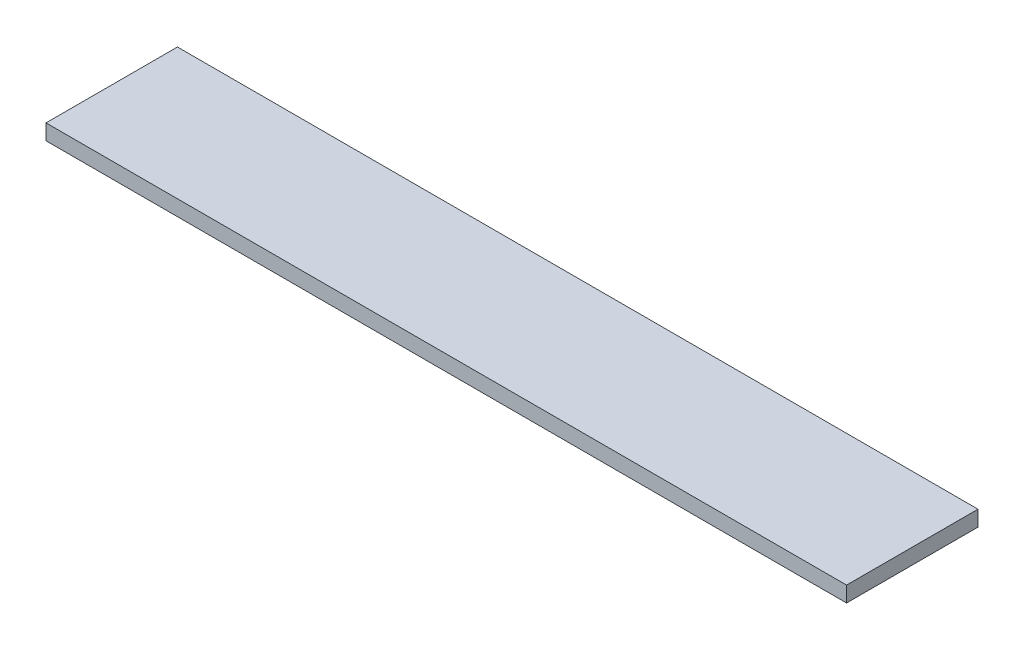
ISO-10303-21;
HEADER;
FILE_DESCRIPTION(('STEP AP214'),'2;1');
FILE_NAME('part.step','',(''),(''),'','','');
FILE_SCHEMA(('AUTOMOTIVE_DESIGN { 1 0 10303 214 1 1 1 1 }'));
ENDSEC;
DATA;
#1=APPLICATION_CONTEXT('core data for automotive mechanical design processes');
#2=APPLICATION_PROTOCOL_DEFINITION('international standard','automotive_design',2000,#1);
#3=PRODUCT_CONTEXT('',#1,'mechanical');
#4=PRODUCT('Part','Part','',(#3));
#5=PRODUCT_RELATED_PRODUCT_CATEGORY('part','',(#4));
#6=PRODUCT_DEFINITION_FORMATION('','',#4);
#7=PRODUCT_DEFINITION_CONTEXT('part definition',#1,'design');
#8=PRODUCT_DEFINITION('design','',#6,#7);
#9=PRODUCT_DEFINITION_SHAPE('','',#8);
#10=(LENGTH_UNIT() NAMED_UNIT(*) SI_UNIT(.MILLI.,.METRE.));
#11=(NAMED_UNIT(*) PLANE_ANGLE_UNIT() SI_UNIT($,.RADIAN.));
#12=(NAMED_UNIT(*) SI_UNIT($,.STERADIAN.) SOLID_ANGLE_UNIT());
#13=UNCERTAINTY_MEASURE_WITH_UNIT(LENGTH_MEASURE(1.E-05),#10,'distance_accuracy_value','');
#14=(GEOMETRIC_REPRESENTATION_CONTEXT(3) GLOBAL_UNCERTAINTY_ASSIGNED_CONTEXT((#13)) GLOBAL_UNIT_ASSIGNED_CONTEXT((#10,
#11,#12)) REPRESENTATION_CONTEXT('',''));
#15=CARTESIAN_POINT('',(0.,0.,0.));
#16=DIRECTION('',(0.,0.,1.));
#17=DIRECTION('',(1.,0.,0.));
#18=AXIS2_PLACEMENT_3D('',#15,#16,#17);
#19=CARTESIAN_POINT('',(-15.625,1.3,-7.5));
#20=DIRECTION('',(1.,0.,0.));
#21=DIRECTION('',(0.,0.,-1.));
#22=AXIS2_PLACEMENT_3D('',#19,#20,#21);
#23=PLANE('',#22);
#24=DIRECTION('',(0.,0.,1.));
#25=VECTOR('',#24,1.);
#26=CARTESIAN_POINT('',(-15.625,0.,-7.5));
#27=LINE('',#26,#25);
#28=CARTESIAN_POINT('',(-15.625,0.,-7.5));
#29=VERTEX_POINT('',#28);
#30=CARTESIAN_POINT('',(-15.625,0.,3.5));
#31=VERTEX_POINT('',#30);
#32=EDGE_CURVE('E113',#29,#31,#27,.T.);
#33=ORIENTED_EDGE('',*,*,#32,.T.);
#34=DIRECTION('',(0.,-1.,0.));
#35=VECTOR('',#34,1.);
#36=CARTESIAN_POINT('',(-15.625,1.3,3.5));
#37=LINE('',#36,#35);
#38=CARTESIAN_POINT('',(-15.625,1.3,3.5));
#39=VERTEX_POINT('',#38);
#40=EDGE_CURVE('E11',#39,#31,#37,.T.);
#41=ORIENTED_EDGE('',*,*,#40,.F.);
#42=DIRECTION('',(0.,0.,1.));
#43=VECTOR('',#42,1.);
#44=CARTESIAN_POINT('',(-15.625,1.3,-7.5));
#45=LINE('',#44,#43);
#46=CARTESIAN_POINT('',(-15.625,1.3,-7.5));
#47=VERTEX_POINT('',#46);
#48=EDGE_CURVE('E97',#47,#39,#45,.T.);
#49=ORIENTED_EDGE('',*,*,#48,.F.);
#50=DIRECTION('',(0.,-1.,0.));
#51=VECTOR('',#50,1.);
#52=CARTESIAN_POINT('',(-15.625,1.3,-7.5));
#53=LINE('',#52,#51);
#54=EDGE_CURVE('E109',#47,#29,#53,.T.);
#55=ORIENTED_EDGE('',*,*,#54,.T.);
#56=EDGE_LOOP('',(#33,#41,#49,#55));
#57=FACE_BOUND('',#56,.T.);
#58=ADVANCED_FACE('F45',(#57),#23,.F.);
#59=CARTESIAN_POINT('',(-15.625,1.3,3.5));
#60=DIRECTION('',(0.,0.,-1.));
#61=DIRECTION('',(-1.,0.,0.));
#62=AXIS2_PLACEMENT_3D('',#59,#60,#61);
#63=PLANE('',#62);
#64=DIRECTION('',(1.,0.,0.));
#65=VECTOR('',#64,1.);
#66=CARTESIAN_POINT('',(-15.625,0.,3.5));
#67=LINE('',#66,#65);
#68=CARTESIAN_POINT('',(51.375,0.,3.5));
#69=VERTEX_POINT('',#68);
#70=EDGE_CURVE('E102',#31,#69,#67,.T.);
#71=ORIENTED_EDGE('',*,*,#70,.T.);
#72=DIRECTION('',(0.,-1.,0.));
#73=VECTOR('',#72,1.);
#74=CARTESIAN_POINT('',(51.375,1.3,3.5));
#75=LINE('',#74,#73);
#76=CARTESIAN_POINT('',(51.375,1.3,3.5));
#77=VERTEX_POINT('',#76);
#78=EDGE_CURVE('E54',#77,#69,#75,.T.);
#79=ORIENTED_EDGE('',*,*,#78,.F.);
#80=DIRECTION('',(1.,0.,0.));
#81=VECTOR('',#80,1.);
#82=CARTESIAN_POINT('',(-15.625,1.3,3.5));
#83=LINE('',#82,#81);
#84=EDGE_CURVE('E92',#39,#77,#83,.T.);
#85=ORIENTED_EDGE('',*,*,#84,.F.);
#86=ORIENTED_EDGE('',*,*,#40,.T.);
#87=EDGE_LOOP('',(#71,#79,#85,#86));
#88=FACE_BOUND('',#87,.T.);
#89=ADVANCED_FACE('F101',(#88),#63,.F.);
#90=CARTESIAN_POINT('',(51.375,1.3,-7.5));
#91=DIRECTION('',(-1.,0.,0.));
#92=DIRECTION('',(0.,0.,1.));
#93=AXIS2_PLACEMENT_3D('',#90,#91,#92);
#94=PLANE('',#93);
#95=DIRECTION('',(0.,0.,-1.));
#96=VECTOR('',#95,1.);
#97=CARTESIAN_POINT('',(51.375,0.,-7.5));
#98=LINE('',#97,#96);
#99=CARTESIAN_POINT('',(51.375,0.,-7.5));
#100=VERTEX_POINT('',#99);
#101=EDGE_CURVE('E79',#69,#100,#98,.T.);
#102=ORIENTED_EDGE('',*,*,#101,.T.);
#103=DIRECTION('',(0.,-1.,0.));
#104=VECTOR('',#103,1.);
#105=CARTESIAN_POINT('',(51.375,1.3,-7.5));
#106=LINE('',#105,#104);
#107=CARTESIAN_POINT('',(51.375,1.3,-7.5));
#108=VERTEX_POINT('',#107);
#109=EDGE_CURVE('E104',#108,#100,#106,.T.);
#110=ORIENTED_EDGE('',*,*,#109,.F.);
#111=DIRECTION('',(0.,0.,-1.));
#112=VECTOR('',#111,1.);
#113=CARTESIAN_POINT('',(51.375,1.3,-7.5));
#114=LINE('',#113,#112);
#115=EDGE_CURVE('E95',#77,#108,#114,.T.);
#116=ORIENTED_EDGE('',*,*,#115,.F.);
#117=ORIENTED_EDGE('',*,*,#78,.T.);
#118=EDGE_LOOP('',(#102,#110,#116,#117));
#119=FACE_BOUND('',#118,.T.);
#120=ADVANCED_FACE('F105',(#119),#94,.F.);
#121=CARTESIAN_POINT('',(-15.625,1.3,-7.5));
#122=DIRECTION('',(0.,0.,1.));
#123=DIRECTION('',(1.,0.,0.));
#124=AXIS2_PLACEMENT_3D('',#121,#122,#123);
#125=PLANE('',#124);
#126=DIRECTION('',(-1.,0.,0.));
#127=VECTOR('',#126,1.);
#128=CARTESIAN_POINT('',(-15.625,0.,-7.5));
#129=LINE('',#128,#127);
#130=EDGE_CURVE('E85',#100,#29,#129,.T.);
#131=ORIENTED_EDGE('',*,*,#130,.T.);
#132=ORIENTED_EDGE('',*,*,#54,.F.);
#133=DIRECTION('',(-1.,0.,0.));
#134=VECTOR('',#133,1.);
#135=CARTESIAN_POINT('',(-15.625,1.3,-7.5));
#136=LINE('',#135,#134);
#137=EDGE_CURVE('E62',#108,#47,#136,.T.);
#138=ORIENTED_EDGE('',*,*,#137,.F.);
#139=ORIENTED_EDGE('',*,*,#109,.T.);
#140=EDGE_LOOP('',(#131,#132,#138,#139));
#141=FACE_BOUND('',#140,.T.);
#142=ADVANCED_FACE('F126',(#141),#125,.F.);
#143=CARTESIAN_POINT('',(0.,1.3,0.));
#144=DIRECTION('',(0.,1.,0.));
#145=DIRECTION('',(0.,0.,1.));
#146=AXIS2_PLACEMENT_3D('',#143,#144,#145);
#147=PLANE('',#146);
#148=ORIENTED_EDGE('',*,*,#48,.T.);
#149=ORIENTED_EDGE('',*,*,#84,.T.);
#150=ORIENTED_EDGE('',*,*,#115,.T.);
#151=ORIENTED_EDGE('',*,*,#137,.T.);
#152=EDGE_LOOP('',(#148,#149,#150,#151));
#153=FACE_BOUND('',#152,.T.);
#154=ADVANCED_FACE('F93',(#153),#147,.T.);
#155=CARTESIAN_POINT('',(0.,0.,0.));
#156=DIRECTION('',(0.,1.,0.));
#157=DIRECTION('',(0.,0.,1.));
#158=AXIS2_PLACEMENT_3D('',#155,#156,#157);
#159=PLANE('',#158);
#160=ORIENTED_EDGE('',*,*,#32,.F.);
#161=ORIENTED_EDGE('',*,*,#130,.F.);
#162=ORIENTED_EDGE('',*,*,#101,.F.);
#163=ORIENTED_EDGE('',*,*,#70,.F.);
#164=EDGE_LOOP('',(#160,#161,#162,#163));
#165=FACE_BOUND('',#164,.T.);
#166=ADVANCED_FACE('F129',(#165),#159,.F.);
#167=CLOSED_SHELL('',(#58,#89,#120,#142,#154,#166));
#168=MANIFOLD_SOLID_BREP('B2',#167);
#169=ADVANCED_BREP_SHAPE_REPRESENTATION('',(#18,#168),#14);
#170=SHAPE_DEFINITION_REPRESENTATION(#9,#169);
ENDSEC;
END-ISO-10303-21;
